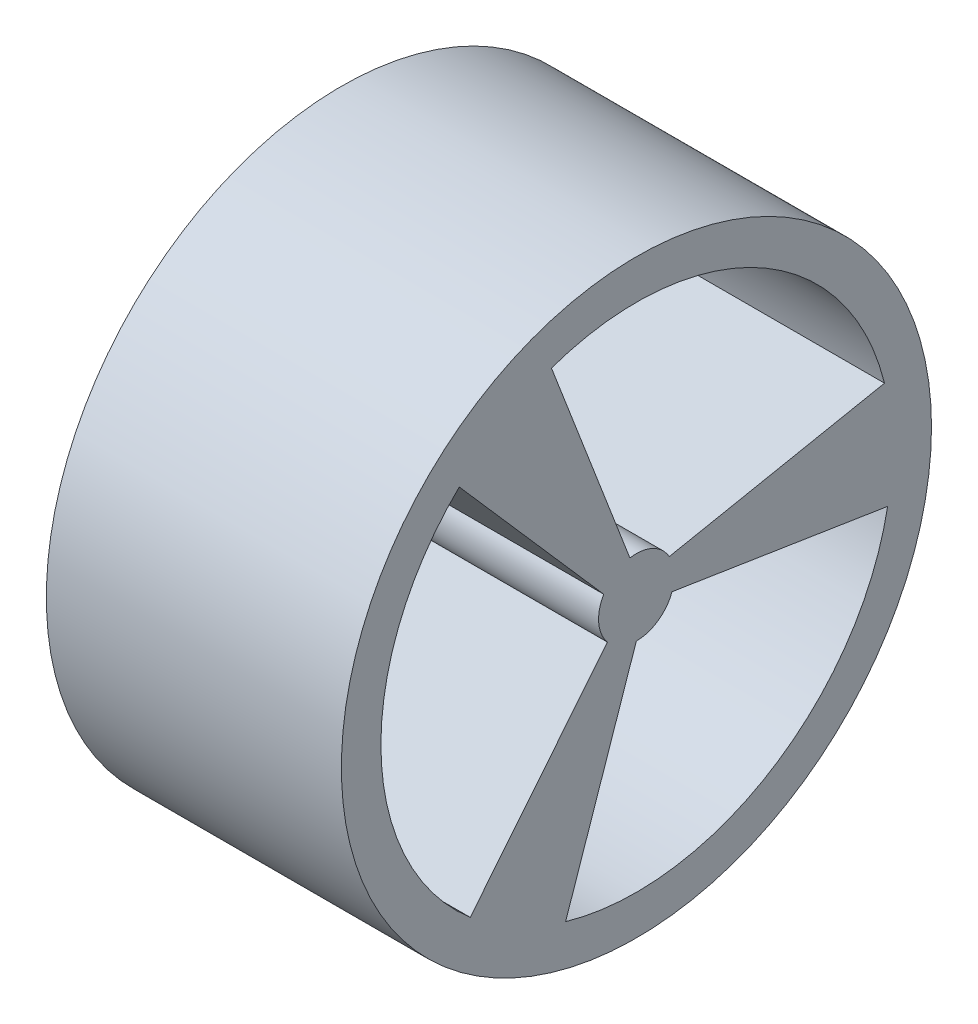
ISO-10303-21;
HEADER;
FILE_DESCRIPTION(('STEP AP214'),'2;1');
FILE_NAME('part.step','',(''),(''),'','','');
FILE_SCHEMA(('AUTOMOTIVE_DESIGN { 1 0 10303 214 1 1 1 1 }'));
ENDSEC;
DATA;
#1=APPLICATION_CONTEXT('core data for automotive mechanical design processes');
#2=APPLICATION_PROTOCOL_DEFINITION('international standard','automotive_design',2000,#1);
#3=PRODUCT_CONTEXT('',#1,'mechanical');
#4=PRODUCT('Part','Part','',(#3));
#5=PRODUCT_RELATED_PRODUCT_CATEGORY('part','',(#4));
#6=PRODUCT_DEFINITION_FORMATION('','',#4);
#7=PRODUCT_DEFINITION_CONTEXT('part definition',#1,'design');
#8=PRODUCT_DEFINITION('design','',#6,#7);
#9=PRODUCT_DEFINITION_SHAPE('','',#8);
#10=(LENGTH_UNIT() NAMED_UNIT(*) SI_UNIT(.MILLI.,.METRE.));
#11=(NAMED_UNIT(*) PLANE_ANGLE_UNIT() SI_UNIT($,.RADIAN.));
#12=(NAMED_UNIT(*) SI_UNIT($,.STERADIAN.) SOLID_ANGLE_UNIT());
#13=UNCERTAINTY_MEASURE_WITH_UNIT(LENGTH_MEASURE(1.E-05),#10,'distance_accuracy_value','');
#14=(GEOMETRIC_REPRESENTATION_CONTEXT(3) GLOBAL_UNCERTAINTY_ASSIGNED_CONTEXT((#13)) GLOBAL_UNIT_ASSIGNED_CONTEXT((#10,
#11,#12)) REPRESENTATION_CONTEXT('',''));
#15=CARTESIAN_POINT('',(0.,0.,0.));
#16=DIRECTION('',(0.,0.,1.));
#17=DIRECTION('',(1.,0.,0.));
#18=AXIS2_PLACEMENT_3D('',#15,#16,#17);
#19=CARTESIAN_POINT('',(10.,0.,0.));
#20=DIRECTION('',(-1.,0.,0.));
#21=DIRECTION('',(0.,0.,1.));
#22=AXIS2_PLACEMENT_3D('',#19,#20,#21);
#23=CYLINDRICAL_SURFACE('',#22,10.);
#24=CARTESIAN_POINT('',(10.,0.,0.));
#25=DIRECTION('',(1.,0.,0.));
#26=DIRECTION('',(0.,0.,-1.));
#27=AXIS2_PLACEMENT_3D('',#24,#25,#26);
#28=CIRCLE('',#27,10.);
#29=CARTESIAN_POINT('',(10.,0.,-10.));
#30=VERTEX_POINT('',#29);
#31=EDGE_CURVE('E11',#30,#30,#28,.T.);
#32=ORIENTED_EDGE('',*,*,#31,.F.);
#33=EDGE_LOOP('',(#32));
#34=FACE_BOUND('',#33,.T.);
#35=CARTESIAN_POINT('',(0.,0.,0.));
#36=DIRECTION('',(1.,0.,0.));
#37=DIRECTION('',(0.,0.,-1.));
#38=AXIS2_PLACEMENT_3D('',#35,#36,#37);
#39=CIRCLE('',#38,10.);
#40=CARTESIAN_POINT('',(0.,0.,-10.));
#41=VERTEX_POINT('',#40);
#42=EDGE_CURVE('E36',#41,#41,#39,.T.);
#43=ORIENTED_EDGE('',*,*,#42,.T.);
#44=EDGE_LOOP('',(#43));
#45=FACE_BOUND('',#44,.T.);
#46=ADVANCED_FACE('F33',(#34,#45),#23,.T.);
#47=CARTESIAN_POINT('',(10.,0.,0.));
#48=DIRECTION('',(1.,0.,0.));
#49=DIRECTION('',(0.,0.,-1.));
#50=AXIS2_PLACEMENT_3D('',#47,#48,#49);
#51=PLANE('',#50);
#52=CARTESIAN_POINT('',(10.,0.,0.));
#53=DIRECTION('',(1.,0.,0.));
#54=DIRECTION('',(0.,0.,-1.));
#55=AXIS2_PLACEMENT_3D('',#52,#53,#54);
#56=CIRCLE('',#55,8.66019970519135);
#57=CARTESIAN_POINT('',(10.,-8.32067019659538,2.40114689539929));
#58=VERTEX_POINT('',#57);
#59=CARTESIAN_POINT('',(10.,-1.58886535925507,-8.51319950453151));
#60=VERTEX_POINT('',#59);
#61=EDGE_CURVE('E47',#58,#60,#56,.T.);
#62=ORIENTED_EDGE('',*,*,#61,.F.);
#63=DIRECTION('',(0.,-0.946565025916032,0.322513025647928));
#64=VECTOR('',#63,1.);
#65=CARTESIAN_POINT('',(10.,-8.32067019659538,2.40114689539929));
#66=LINE('',#65,#64);
#67=CARTESIAN_POINT('',(10.,-1.28390518829077,0.00358485637768388));
#68=VERTEX_POINT('',#67);
#69=EDGE_CURVE('E166',#68,#58,#66,.T.);
#70=ORIENTED_EDGE('',*,*,#69,.F.);
#71=CARTESIAN_POINT('',(10.,0.,0.));
#72=DIRECTION('',(-1.,0.,0.));
#73=DIRECTION('',(0.,0.,1.));
#74=AXIS2_PLACEMENT_3D('',#71,#72,#73);
#75=CIRCLE('',#74,1.28391019301009);
#76=CARTESIAN_POINT('',(10.,-0.440608175742145,-1.20593939283215));
#77=VERTEX_POINT('',#76);
#78=EDGE_CURVE('E180',#77,#68,#75,.T.);
#79=ORIENTED_EDGE('',*,*,#78,.F.);
#80=DIRECTION('',(0.,0.155234331382656,0.987877675808184));
#81=VECTOR('',#80,1.);
#82=CARTESIAN_POINT('',(10.,-1.58886535925507,-8.51319950453151));
#83=LINE('',#82,#81);
#84=EDGE_CURVE('E177',#60,#77,#83,.T.);
#85=ORIENTED_EDGE('',*,*,#84,.F.);
#86=EDGE_LOOP('',(#62,#70,#79,#85));
#87=FACE_BOUND('',#86,.T.);
#88=CARTESIAN_POINT('',(10.,0.,0.));
#89=DIRECTION('',(1.,0.,0.));
#90=DIRECTION('',(0.,0.,-1.));
#91=AXIS2_PLACEMENT_3D('',#88,#89,#90);
#92=CIRCLE('',#91,8.66019970519134);
#93=CARTESIAN_POINT('',(10.,2.08088088866376,-8.40648521446331));
#94=VERTEX_POINT('',#93);
#95=CARTESIAN_POINT('',(10.,8.16707971803691,2.88060198795778));
#96=VERTEX_POINT('',#95);
#97=EDGE_CURVE('E55',#94,#96,#92,.T.);
#98=ORIENTED_EDGE('',*,*,#97,.F.);
#99=DIRECTION('',(0.,0.193978039695527,-0.981005871601124));
#100=VECTOR('',#99,1.);
#101=CARTESIAN_POINT('',(10.,2.08088088866376,-8.40648521446331));
#102=LINE('',#101,#100);
#103=CARTESIAN_POINT('',(10.,0.638848017453396,-1.11368693729929));
#104=VERTEX_POINT('',#103);
#105=EDGE_CURVE('E142',#104,#94,#102,.T.);
#106=ORIENTED_EDGE('',*,*,#105,.F.);
#107=CARTESIAN_POINT('',(10.,0.,0.));
#108=DIRECTION('',(-1.,0.,0.));
#109=DIRECTION('',(0.,0.,1.));
#110=AXIS2_PLACEMENT_3D('',#107,#108,#109);
#111=CIRCLE('',#110,1.28391019301009);
#112=CARTESIAN_POINT('',(10.,1.2646782374881,0.221391823108267));
#113=VERTEX_POINT('',#112);
#114=EDGE_CURVE('E145',#113,#104,#111,.T.);
#115=ORIENTED_EDGE('',*,*,#114,.F.);
#116=DIRECTION('',(0.,-0.933144328772744,-0.35950196338722));
#117=VECTOR('',#116,1.);
#118=CARTESIAN_POINT('',(10.,8.16707971803691,2.88060198795778));
#119=LINE('',#118,#117);
#120=EDGE_CURVE('E151',#96,#113,#119,.T.);
#121=ORIENTED_EDGE('',*,*,#120,.F.);
#122=EDGE_LOOP('',(#98,#106,#115,#121));
#123=FACE_BOUND('',#122,.T.);
#124=CARTESIAN_POINT('',(10.,0.,0.));
#125=DIRECTION('',(1.,0.,0.));
#126=DIRECTION('',(0.,0.,-1.));
#127=AXIS2_PLACEMENT_3D('',#124,#125,#126);
#128=CIRCLE('',#127,8.66019970519134);
#129=CARTESIAN_POINT('',(10.,6.23978930793162,6.00533831906401));
#130=VERTEX_POINT('',#129);
#131=CARTESIAN_POINT('',(10.,-6.57821435878185,5.63259751657373));
#132=VERTEX_POINT('',#131);
#133=EDGE_CURVE('E158',#130,#132,#128,.T.);
#134=ORIENTED_EDGE('',*,*,#133,.F.);
#135=DIRECTION('',(0.,0.752586986220505,0.658492845953194));
#136=VECTOR('',#135,1.);
#137=CARTESIAN_POINT('',(10.,6.23978930793162,6.00533831906401));
#138=LINE('',#137,#136);
#139=CARTESIAN_POINT('',(10.,0.645057170837367,1.11010208092161));
#140=VERTEX_POINT('',#139);
#141=EDGE_CURVE('E195',#140,#130,#138,.T.);
#142=ORIENTED_EDGE('',*,*,#141,.F.);
#143=CARTESIAN_POINT('',(10.,0.,0.));
#144=DIRECTION('',(-1.,0.,0.));
#145=DIRECTION('',(0.,0.,1.));
#146=AXIS2_PLACEMENT_3D('',#143,#144,#145);
#147=CIRCLE('',#146,1.28391019301009);
#148=CARTESIAN_POINT('',(10.,-0.824070061745963,0.984547569723884));
#149=VERTEX_POINT('',#148);
#150=EDGE_CURVE('E209',#149,#140,#147,.T.);
#151=ORIENTED_EDGE('',*,*,#150,.F.);
#152=DIRECTION('',(0.,0.777909997390086,-0.628375712420965));
#153=VECTOR('',#152,1.);
#154=CARTESIAN_POINT('',(10.,-6.57821435878185,5.63259751657373));
#155=LINE('',#154,#153);
#156=EDGE_CURVE('E206',#132,#149,#155,.T.);
#157=ORIENTED_EDGE('',*,*,#156,.F.);
#158=EDGE_LOOP('',(#134,#142,#151,#157));
#159=FACE_BOUND('',#158,.T.);
#160=ORIENTED_EDGE('',*,*,#31,.T.);
#161=EDGE_LOOP('',(#160));
#162=FACE_BOUND('',#161,.T.);
#163=ADVANCED_FACE('F231',(#87,#123,#159,#162),#51,.T.);
#164=CARTESIAN_POINT('',(0.,0.,0.));
#165=DIRECTION('',(1.,0.,0.));
#166=DIRECTION('',(0.,0.,-1.));
#167=AXIS2_PLACEMENT_3D('',#164,#165,#166);
#168=PLANE('',#167);
#169=DIRECTION('',(0.,-0.946565025916032,0.322513025647928));
#170=VECTOR('',#169,1.);
#171=CARTESIAN_POINT('',(0.,-8.32067019659538,2.40114689539929));
#172=LINE('',#171,#170);
#173=CARTESIAN_POINT('',(0.,-1.28390518829077,0.00358485637768388));
#174=VERTEX_POINT('',#173);
#175=CARTESIAN_POINT('',(0.,-8.32067019659538,2.40114689539929));
#176=VERTEX_POINT('',#175);
#177=EDGE_CURVE('E172',#174,#176,#172,.T.);
#178=ORIENTED_EDGE('',*,*,#177,.T.);
#179=CARTESIAN_POINT('',(0.,0.,0.));
#180=DIRECTION('',(1.,0.,0.));
#181=DIRECTION('',(0.,0.,-1.));
#182=AXIS2_PLACEMENT_3D('',#179,#180,#181);
#183=CIRCLE('',#182,8.66019970519135);
#184=CARTESIAN_POINT('',(0.,-1.58886535925507,-8.51319950453151));
#185=VERTEX_POINT('',#184);
#186=EDGE_CURVE('E162',#176,#185,#183,.T.);
#187=ORIENTED_EDGE('',*,*,#186,.T.);
#188=DIRECTION('',(0.,0.155234331382656,0.987877675808184));
#189=VECTOR('',#188,1.);
#190=CARTESIAN_POINT('',(0.,-1.58886535925507,-8.51319950453151));
#191=LINE('',#190,#189);
#192=CARTESIAN_POINT('',(0.,-0.440608175742145,-1.20593939283215));
#193=VERTEX_POINT('',#192);
#194=EDGE_CURVE('E165',#185,#193,#191,.T.);
#195=ORIENTED_EDGE('',*,*,#194,.T.);
#196=CARTESIAN_POINT('',(0.,0.,0.));
#197=DIRECTION('',(-1.,0.,0.));
#198=DIRECTION('',(0.,0.,1.));
#199=AXIS2_PLACEMENT_3D('',#196,#197,#198);
#200=CIRCLE('',#199,1.28391019301009);
#201=EDGE_CURVE('E169',#193,#174,#200,.T.);
#202=ORIENTED_EDGE('',*,*,#201,.T.);
#203=EDGE_LOOP('',(#178,#187,#195,#202));
#204=FACE_BOUND('',#203,.T.);
#205=DIRECTION('',(0.,0.193978039695527,-0.981005871601124));
#206=VECTOR('',#205,1.);
#207=CARTESIAN_POINT('',(0.,2.08088088866376,-8.40648521446331));
#208=LINE('',#207,#206);
#209=CARTESIAN_POINT('',(0.,0.638848017453396,-1.11368693729929));
#210=VERTEX_POINT('',#209);
#211=CARTESIAN_POINT('',(0.,2.08088088866376,-8.40648521446331));
#212=VERTEX_POINT('',#211);
#213=EDGE_CURVE('E129',#210,#212,#208,.T.);
#214=ORIENTED_EDGE('',*,*,#213,.T.);
#215=CARTESIAN_POINT('',(0.,0.,0.));
#216=DIRECTION('',(1.,0.,0.));
#217=DIRECTION('',(0.,0.,-1.));
#218=AXIS2_PLACEMENT_3D('',#215,#216,#217);
#219=CIRCLE('',#218,8.66019970519134);
#220=CARTESIAN_POINT('',(0.,8.16707971803691,2.88060198795778));
#221=VERTEX_POINT('',#220);
#222=EDGE_CURVE('E123',#212,#221,#219,.T.);
#223=ORIENTED_EDGE('',*,*,#222,.T.);
#224=DIRECTION('',(0.,-0.933144328772744,-0.35950196338722));
#225=VECTOR('',#224,1.);
#226=CARTESIAN_POINT('',(0.,8.16707971803691,2.88060198795778));
#227=LINE('',#226,#225);
#228=CARTESIAN_POINT('',(0.,1.2646782374881,0.221391823108267));
#229=VERTEX_POINT('',#228);
#230=EDGE_CURVE('E133',#221,#229,#227,.T.);
#231=ORIENTED_EDGE('',*,*,#230,.T.);
#232=CARTESIAN_POINT('',(0.,0.,0.));
#233=DIRECTION('',(-1.,0.,0.));
#234=DIRECTION('',(0.,0.,1.));
#235=AXIS2_PLACEMENT_3D('',#232,#233,#234);
#236=CIRCLE('',#235,1.28391019301009);
#237=EDGE_CURVE('E137',#229,#210,#236,.T.);
#238=ORIENTED_EDGE('',*,*,#237,.T.);
#239=EDGE_LOOP('',(#214,#223,#231,#238));
#240=FACE_BOUND('',#239,.T.);
#241=DIRECTION('',(0.,0.752586986220505,0.658492845953194));
#242=VECTOR('',#241,1.);
#243=CARTESIAN_POINT('',(0.,6.23978930793162,6.00533831906401));
#244=LINE('',#243,#242);
#245=CARTESIAN_POINT('',(0.,0.645057170837367,1.11010208092161));
#246=VERTEX_POINT('',#245);
#247=CARTESIAN_POINT('',(0.,6.23978930793162,6.00533831906401));
#248=VERTEX_POINT('',#247);
#249=EDGE_CURVE('E201',#246,#248,#244,.T.);
#250=ORIENTED_EDGE('',*,*,#249,.T.);
#251=CARTESIAN_POINT('',(0.,0.,0.));
#252=DIRECTION('',(1.,0.,0.));
#253=DIRECTION('',(0.,0.,-1.));
#254=AXIS2_PLACEMENT_3D('',#251,#252,#253);
#255=CIRCLE('',#254,8.66019970519134);
#256=CARTESIAN_POINT('',(0.,-6.57821435878185,5.63259751657373));
#257=VERTEX_POINT('',#256);
#258=EDGE_CURVE('E191',#248,#257,#255,.T.);
#259=ORIENTED_EDGE('',*,*,#258,.T.);
#260=DIRECTION('',(0.,0.777909997390086,-0.628375712420965));
#261=VECTOR('',#260,1.);
#262=CARTESIAN_POINT('',(0.,-6.57821435878185,5.63259751657373));
#263=LINE('',#262,#261);
#264=CARTESIAN_POINT('',(0.,-0.824070061745963,0.984547569723884));
#265=VERTEX_POINT('',#264);
#266=EDGE_CURVE('E194',#257,#265,#263,.T.);
#267=ORIENTED_EDGE('',*,*,#266,.T.);
#268=CARTESIAN_POINT('',(0.,0.,0.));
#269=DIRECTION('',(-1.,0.,0.));
#270=DIRECTION('',(0.,0.,1.));
#271=AXIS2_PLACEMENT_3D('',#268,#269,#270);
#272=CIRCLE('',#271,1.28391019301009);
#273=EDGE_CURVE('E198',#265,#246,#272,.T.);
#274=ORIENTED_EDGE('',*,*,#273,.T.);
#275=EDGE_LOOP('',(#250,#259,#267,#274));
#276=FACE_BOUND('',#275,.T.);
#277=ORIENTED_EDGE('',*,*,#42,.F.);
#278=EDGE_LOOP('',(#277));
#279=FACE_BOUND('',#278,.T.);
#280=ADVANCED_FACE('F139',(#204,#240,#276,#279),#168,.F.);
#281=CARTESIAN_POINT('',(0.,0.,0.));
#282=DIRECTION('',(1.,0.,0.));
#283=DIRECTION('',(0.,0.,-1.));
#284=AXIS2_PLACEMENT_3D('',#281,#282,#283);
#285=CYLINDRICAL_SURFACE('',#284,8.66019970519134);
#286=ORIENTED_EDGE('',*,*,#133,.T.);
#287=DIRECTION('',(1.,0.,0.));
#288=VECTOR('',#287,1.);
#289=CARTESIAN_POINT('',(0.,-6.57821435878185,5.63259751657373));
#290=LINE('',#289,#288);
#291=EDGE_CURVE('E204',#257,#132,#290,.T.);
#292=ORIENTED_EDGE('',*,*,#291,.F.);
#293=ORIENTED_EDGE('',*,*,#258,.F.);
#294=DIRECTION('',(1.,0.,0.));
#295=VECTOR('',#294,1.);
#296=CARTESIAN_POINT('',(0.,6.23978930793162,6.00533831906401));
#297=LINE('',#296,#295);
#298=EDGE_CURVE('E214',#248,#130,#297,.T.);
#299=ORIENTED_EDGE('',*,*,#298,.T.);
#300=EDGE_LOOP('',(#286,#292,#293,#299));
#301=FACE_BOUND('',#300,.T.);
#302=ADVANCED_FACE('F238',(#301),#285,.F.);
#303=CARTESIAN_POINT('',(0.,6.23978930793162,6.00533831906401));
#304=DIRECTION('',(0.,0.658492845953194,-0.752586986220505));
#305=DIRECTION('',(0.,0.752586986220505,0.658492845953194));
#306=AXIS2_PLACEMENT_3D('',#303,#304,#305);
#307=PLANE('',#306);
#308=ORIENTED_EDGE('',*,*,#141,.T.);
#309=ORIENTED_EDGE('',*,*,#298,.F.);
#310=ORIENTED_EDGE('',*,*,#249,.F.);
#311=DIRECTION('',(1.,0.,0.));
#312=VECTOR('',#311,1.);
#313=CARTESIAN_POINT('',(0.,0.645057170837367,1.11010208092161));
#314=LINE('',#313,#312);
#315=EDGE_CURVE('E216',#246,#140,#314,.T.);
#316=ORIENTED_EDGE('',*,*,#315,.T.);
#317=EDGE_LOOP('',(#308,#309,#310,#316));
#318=FACE_BOUND('',#317,.T.);
#319=ADVANCED_FACE('F240',(#318),#307,.F.);
#320=CARTESIAN_POINT('',(0.,0.,0.));
#321=DIRECTION('',(1.,0.,0.));
#322=DIRECTION('',(0.,0.,-1.));
#323=AXIS2_PLACEMENT_3D('',#320,#321,#322);
#324=CYLINDRICAL_SURFACE('',#323,1.28391019301009);
#325=ORIENTED_EDGE('',*,*,#150,.T.);
#326=ORIENTED_EDGE('',*,*,#315,.F.);
#327=ORIENTED_EDGE('',*,*,#273,.F.);
#328=DIRECTION('',(1.,0.,0.));
#329=VECTOR('',#328,1.);
#330=CARTESIAN_POINT('',(0.,-0.824070061745963,0.984547569723884));
#331=LINE('',#330,#329);
#332=EDGE_CURVE('E218',#265,#149,#331,.T.);
#333=ORIENTED_EDGE('',*,*,#332,.T.);
#334=EDGE_LOOP('',(#325,#326,#327,#333));
#335=FACE_BOUND('',#334,.T.);
#336=ADVANCED_FACE('F235',(#335),#324,.T.);
#337=CARTESIAN_POINT('',(0.,-6.57821435878185,5.63259751657373));
#338=DIRECTION('',(0.,-0.628375712420965,-0.777909997390086));
#339=DIRECTION('',(0.,0.777909997390086,-0.628375712420965));
#340=AXIS2_PLACEMENT_3D('',#337,#338,#339);
#341=PLANE('',#340);
#342=ORIENTED_EDGE('',*,*,#156,.T.);
#343=ORIENTED_EDGE('',*,*,#332,.F.);
#344=ORIENTED_EDGE('',*,*,#266,.F.);
#345=ORIENTED_EDGE('',*,*,#291,.T.);
#346=EDGE_LOOP('',(#342,#343,#344,#345));
#347=FACE_BOUND('',#346,.T.);
#348=ADVANCED_FACE('F224',(#347),#341,.F.);
#349=CARTESIAN_POINT('',(0.,0.,0.));
#350=DIRECTION('',(1.,0.,0.));
#351=DIRECTION('',(0.,0.,-1.));
#352=AXIS2_PLACEMENT_3D('',#349,#350,#351);
#353=CYLINDRICAL_SURFACE('',#352,8.66019970519134);
#354=ORIENTED_EDGE('',*,*,#97,.T.);
#355=DIRECTION('',(1.,0.,0.));
#356=VECTOR('',#355,1.);
#357=CARTESIAN_POINT('',(0.,8.16707971803691,2.88060198795778));
#358=LINE('',#357,#356);
#359=EDGE_CURVE('E119',#221,#96,#358,.T.);
#360=ORIENTED_EDGE('',*,*,#359,.F.);
#361=ORIENTED_EDGE('',*,*,#222,.F.);
#362=DIRECTION('',(1.,0.,0.));
#363=VECTOR('',#362,1.);
#364=CARTESIAN_POINT('',(0.,2.08088088866376,-8.40648521446331));
#365=LINE('',#364,#363);
#366=EDGE_CURVE('E156',#212,#94,#365,.T.);
#367=ORIENTED_EDGE('',*,*,#366,.T.);
#368=EDGE_LOOP('',(#354,#360,#361,#367));
#369=FACE_BOUND('',#368,.T.);
#370=ADVANCED_FACE('F121',(#369),#353,.F.);
#371=CARTESIAN_POINT('',(0.,2.08088088866376,-8.40648521446331));
#372=DIRECTION('',(0.,-0.981005871601124,-0.193978039695527));
#373=DIRECTION('',(0.,0.193978039695527,-0.981005871601124));
#374=AXIS2_PLACEMENT_3D('',#371,#372,#373);
#375=PLANE('',#374);
#376=ORIENTED_EDGE('',*,*,#105,.T.);
#377=ORIENTED_EDGE('',*,*,#366,.F.);
#378=ORIENTED_EDGE('',*,*,#213,.F.);
#379=DIRECTION('',(1.,0.,0.));
#380=VECTOR('',#379,1.);
#381=CARTESIAN_POINT('',(0.,0.638848017453396,-1.11368693729929));
#382=LINE('',#381,#380);
#383=EDGE_CURVE('E159',#210,#104,#382,.T.);
#384=ORIENTED_EDGE('',*,*,#383,.T.);
#385=EDGE_LOOP('',(#376,#377,#378,#384));
#386=FACE_BOUND('',#385,.T.);
#387=ADVANCED_FACE('F270',(#386),#375,.F.);
#388=CARTESIAN_POINT('',(0.,0.,0.));
#389=DIRECTION('',(1.,0.,0.));
#390=DIRECTION('',(0.,0.,-1.));
#391=AXIS2_PLACEMENT_3D('',#388,#389,#390);
#392=CYLINDRICAL_SURFACE('',#391,1.28391019301009);
#393=ORIENTED_EDGE('',*,*,#114,.T.);
#394=ORIENTED_EDGE('',*,*,#383,.F.);
#395=ORIENTED_EDGE('',*,*,#237,.F.);
#396=DIRECTION('',(1.,0.,0.));
#397=VECTOR('',#396,1.);
#398=CARTESIAN_POINT('',(0.,1.2646782374881,0.221391823108267));
#399=LINE('',#398,#397);
#400=EDGE_CURVE('E128',#229,#113,#399,.T.);
#401=ORIENTED_EDGE('',*,*,#400,.T.);
#402=EDGE_LOOP('',(#393,#394,#395,#401));
#403=FACE_BOUND('',#402,.T.);
#404=ADVANCED_FACE('F275',(#403),#392,.T.);
#405=CARTESIAN_POINT('',(0.,8.16707971803691,2.88060198795778));
#406=DIRECTION('',(0.,-0.35950196338722,0.933144328772744));
#407=DIRECTION('',(0.,-0.933144328772744,-0.35950196338722));
#408=AXIS2_PLACEMENT_3D('',#405,#406,#407);
#409=PLANE('',#408);
#410=ORIENTED_EDGE('',*,*,#120,.T.);
#411=ORIENTED_EDGE('',*,*,#400,.F.);
#412=ORIENTED_EDGE('',*,*,#230,.F.);
#413=ORIENTED_EDGE('',*,*,#359,.T.);
#414=EDGE_LOOP('',(#410,#411,#412,#413));
#415=FACE_BOUND('',#414,.T.);
#416=ADVANCED_FACE('F134',(#415),#409,.F.);
#417=CARTESIAN_POINT('',(0.,0.,0.));
#418=DIRECTION('',(1.,0.,0.));
#419=DIRECTION('',(0.,0.,-1.));
#420=AXIS2_PLACEMENT_3D('',#417,#418,#419);
#421=CYLINDRICAL_SURFACE('',#420,8.66019970519135);
#422=ORIENTED_EDGE('',*,*,#61,.T.);
#423=DIRECTION('',(1.,0.,0.));
#424=VECTOR('',#423,1.);
#425=CARTESIAN_POINT('',(0.,-1.58886535925507,-8.51319950453151));
#426=LINE('',#425,#424);
#427=EDGE_CURVE('E175',#185,#60,#426,.T.);
#428=ORIENTED_EDGE('',*,*,#427,.F.);
#429=ORIENTED_EDGE('',*,*,#186,.F.);
#430=DIRECTION('',(1.,0.,0.));
#431=VECTOR('',#430,1.);
#432=CARTESIAN_POINT('',(0.,-8.32067019659538,2.40114689539929));
#433=LINE('',#432,#431);
#434=EDGE_CURVE('E152',#176,#58,#433,.T.);
#435=ORIENTED_EDGE('',*,*,#434,.T.);
#436=EDGE_LOOP('',(#422,#428,#429,#435));
#437=FACE_BOUND('',#436,.T.);
#438=ADVANCED_FACE('F285',(#437),#421,.F.);
#439=CARTESIAN_POINT('',(0.,-8.32067019659538,2.40114689539929));
#440=DIRECTION('',(0.,0.322513025647928,0.946565025916032));
#441=DIRECTION('',(0.,-0.946565025916032,0.322513025647928));
#442=AXIS2_PLACEMENT_3D('',#439,#440,#441);
#443=PLANE('',#442);
#444=ORIENTED_EDGE('',*,*,#69,.T.);
#445=ORIENTED_EDGE('',*,*,#434,.F.);
#446=ORIENTED_EDGE('',*,*,#177,.F.);
#447=DIRECTION('',(1.,0.,0.));
#448=VECTOR('',#447,1.);
#449=CARTESIAN_POINT('',(0.,-1.28390518829077,0.00358485637768388));
#450=LINE('',#449,#448);
#451=EDGE_CURVE('E186',#174,#68,#450,.T.);
#452=ORIENTED_EDGE('',*,*,#451,.T.);
#453=EDGE_LOOP('',(#444,#445,#446,#452));
#454=FACE_BOUND('',#453,.T.);
#455=ADVANCED_FACE('F281',(#454),#443,.F.);
#456=CARTESIAN_POINT('',(0.,0.,0.));
#457=DIRECTION('',(1.,0.,0.));
#458=DIRECTION('',(0.,0.,-1.));
#459=AXIS2_PLACEMENT_3D('',#456,#457,#458);
#460=CYLINDRICAL_SURFACE('',#459,1.28391019301009);
#461=ORIENTED_EDGE('',*,*,#78,.T.);
#462=ORIENTED_EDGE('',*,*,#451,.F.);
#463=ORIENTED_EDGE('',*,*,#201,.F.);
#464=DIRECTION('',(1.,0.,0.));
#465=VECTOR('',#464,1.);
#466=CARTESIAN_POINT('',(0.,-0.440608175742145,-1.20593939283215));
#467=LINE('',#466,#465);
#468=EDGE_CURVE('E188',#193,#77,#467,.T.);
#469=ORIENTED_EDGE('',*,*,#468,.T.);
#470=EDGE_LOOP('',(#461,#462,#463,#469));
#471=FACE_BOUND('',#470,.T.);
#472=ADVANCED_FACE('F284',(#471),#460,.T.);
#473=CARTESIAN_POINT('',(0.,-1.58886535925507,-8.51319950453151));
#474=DIRECTION('',(0.,0.987877675808184,-0.155234331382656));
#475=DIRECTION('',(0.,0.155234331382656,0.987877675808184));
#476=AXIS2_PLACEMENT_3D('',#473,#474,#475);
#477=PLANE('',#476);
#478=ORIENTED_EDGE('',*,*,#84,.T.);
#479=ORIENTED_EDGE('',*,*,#468,.F.);
#480=ORIENTED_EDGE('',*,*,#194,.F.);
#481=ORIENTED_EDGE('',*,*,#427,.T.);
#482=EDGE_LOOP('',(#478,#479,#480,#481));
#483=FACE_BOUND('',#482,.T.);
#484=ADVANCED_FACE('F289',(#483),#477,.F.);
#485=CLOSED_SHELL('',(#46,#163,#280,#302,#319,#336,#348,#370,#387,#404,#416,#438,#455,#472,#484));
#486=MANIFOLD_SOLID_BREP('B2',#485);
#487=ADVANCED_BREP_SHAPE_REPRESENTATION('',(#18,#486),#14);
#488=SHAPE_DEFINITION_REPRESENTATION(#9,#487);
ENDSEC;
END-ISO-10303-21;
